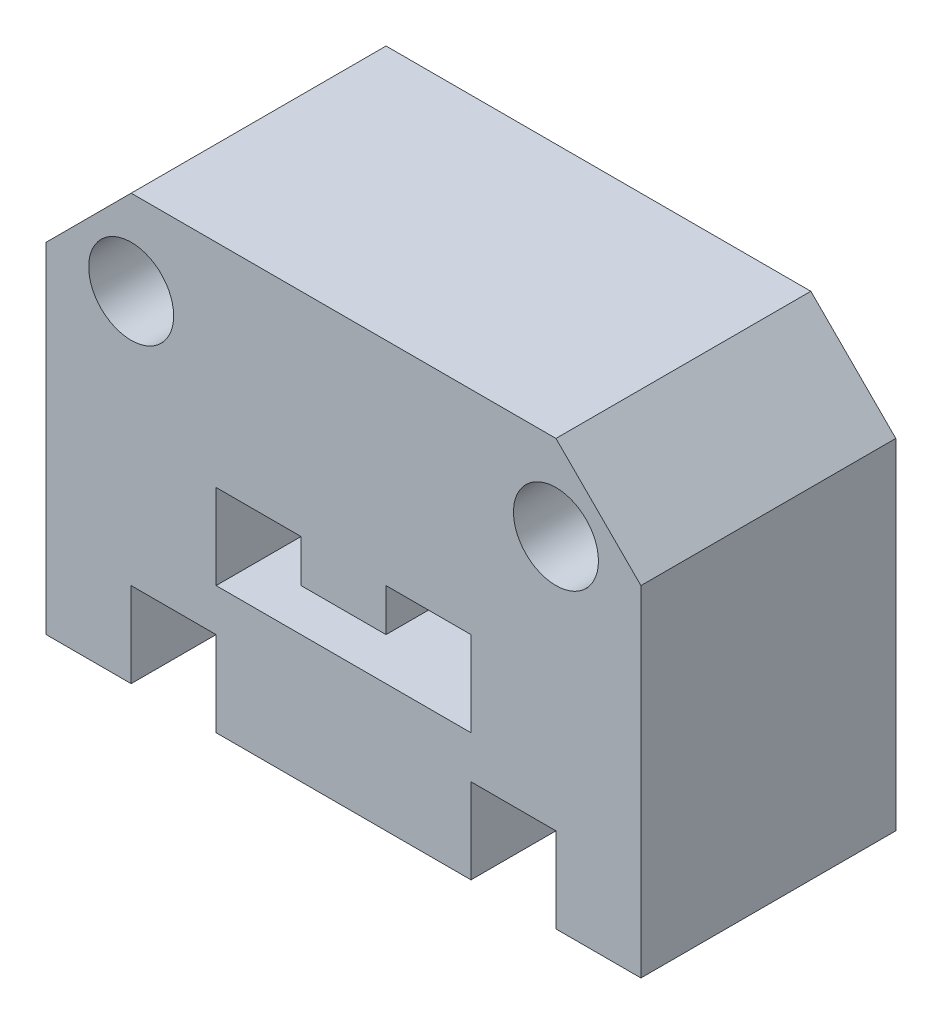
ISO-10303-21;
HEADER;
FILE_DESCRIPTION(('STEP AP214'),'2;1');
FILE_NAME('part.step','',(''),(''),'','','');
FILE_SCHEMA(('AUTOMOTIVE_DESIGN { 1 0 10303 214 1 1 1 1 }'));
ENDSEC;
DATA;
#1=APPLICATION_CONTEXT('core data for automotive mechanical design processes');
#2=APPLICATION_PROTOCOL_DEFINITION('international standard','automotive_design',2000,#1);
#3=PRODUCT_CONTEXT('',#1,'mechanical');
#4=PRODUCT('Part','Part','',(#3));
#5=PRODUCT_RELATED_PRODUCT_CATEGORY('part','',(#4));
#6=PRODUCT_DEFINITION_FORMATION('','',#4);
#7=PRODUCT_DEFINITION_CONTEXT('part definition',#1,'design');
#8=PRODUCT_DEFINITION('design','',#6,#7);
#9=PRODUCT_DEFINITION_SHAPE('','',#8);
#10=(LENGTH_UNIT() NAMED_UNIT(*) SI_UNIT(.MILLI.,.METRE.));
#11=(NAMED_UNIT(*) PLANE_ANGLE_UNIT() SI_UNIT($,.RADIAN.));
#12=(NAMED_UNIT(*) SI_UNIT($,.STERADIAN.) SOLID_ANGLE_UNIT());
#13=UNCERTAINTY_MEASURE_WITH_UNIT(LENGTH_MEASURE(1.E-05),#10,'distance_accuracy_value','');
#14=(GEOMETRIC_REPRESENTATION_CONTEXT(3) GLOBAL_UNCERTAINTY_ASSIGNED_CONTEXT((#13)) GLOBAL_UNIT_ASSIGNED_CONTEXT((#10,
#11,#12)) REPRESENTATION_CONTEXT('',''));
#15=CARTESIAN_POINT('',(0.,0.,0.));
#16=DIRECTION('',(0.,0.,1.));
#17=DIRECTION('',(1.,0.,0.));
#18=AXIS2_PLACEMENT_3D('',#15,#16,#17);
#19=CARTESIAN_POINT('',(0.,0.,15.));
#20=DIRECTION('',(0.,0.,-1.));
#21=DIRECTION('',(-1.,0.,0.));
#22=AXIS2_PLACEMENT_3D('',#19,#20,#21);
#23=PLANE('',#22);
#24=DIRECTION('',(1.,0.,0.));
#25=VECTOR('',#24,1.);
#26=CARTESIAN_POINT('',(25.,0.,15.));
#27=LINE('',#26,#25);
#28=CARTESIAN_POINT('',(25.,0.,15.));
#29=VERTEX_POINT('',#28);
#30=CARTESIAN_POINT('',(35.,0.,15.));
#31=VERTEX_POINT('',#30);
#32=EDGE_CURVE('E258',#29,#31,#27,.T.);
#33=ORIENTED_EDGE('',*,*,#32,.T.);
#34=DIRECTION('',(0.,1.,0.));
#35=VECTOR('',#34,1.);
#36=CARTESIAN_POINT('',(35.,40.,15.));
#37=LINE('',#36,#35);
#38=CARTESIAN_POINT('',(35.,40.,15.));
#39=VERTEX_POINT('',#38);
#40=EDGE_CURVE('E260',#31,#39,#37,.T.);
#41=ORIENTED_EDGE('',*,*,#40,.T.);
#42=DIRECTION('',(-0.707106781186548,0.707106781186547,0.));
#43=VECTOR('',#42,1.);
#44=CARTESIAN_POINT('',(25.,50.,15.));
#45=LINE('',#44,#43);
#46=CARTESIAN_POINT('',(25.,50.,15.));
#47=VERTEX_POINT('',#46);
#48=EDGE_CURVE('E265',#39,#47,#45,.T.);
#49=ORIENTED_EDGE('',*,*,#48,.T.);
#50=DIRECTION('',(-1.,0.,0.));
#51=VECTOR('',#50,1.);
#52=CARTESIAN_POINT('',(-25.,50.,15.));
#53=LINE('',#52,#51);
#54=CARTESIAN_POINT('',(-25.,50.,15.));
#55=VERTEX_POINT('',#54);
#56=EDGE_CURVE('E264',#47,#55,#53,.T.);
#57=ORIENTED_EDGE('',*,*,#56,.T.);
#58=DIRECTION('',(-0.707106781186548,-0.707106781186546,0.));
#59=VECTOR('',#58,1.);
#60=CARTESIAN_POINT('',(-35.,40.,15.));
#61=LINE('',#60,#59);
#62=CARTESIAN_POINT('',(-35.,40.,15.));
#63=VERTEX_POINT('',#62);
#64=EDGE_CURVE('E266',#55,#63,#61,.T.);
#65=ORIENTED_EDGE('',*,*,#64,.T.);
#66=DIRECTION('',(0.,-1.,0.));
#67=VECTOR('',#66,1.);
#68=CARTESIAN_POINT('',(-35.,40.,15.));
#69=LINE('',#68,#67);
#70=CARTESIAN_POINT('',(-35.,0.,15.));
#71=VERTEX_POINT('',#70);
#72=EDGE_CURVE('E268',#63,#71,#69,.T.);
#73=ORIENTED_EDGE('',*,*,#72,.T.);
#74=DIRECTION('',(1.,0.,0.));
#75=VECTOR('',#74,1.);
#76=CARTESIAN_POINT('',(-35.,0.,15.));
#77=LINE('',#76,#75);
#78=CARTESIAN_POINT('',(-25.,0.,15.));
#79=VERTEX_POINT('',#78);
#80=EDGE_CURVE('E269',#71,#79,#77,.T.);
#81=ORIENTED_EDGE('',*,*,#80,.T.);
#82=DIRECTION('',(0.,1.,0.));
#83=VECTOR('',#82,1.);
#84=CARTESIAN_POINT('',(-25.,0.,15.));
#85=LINE('',#84,#83);
#86=CARTESIAN_POINT('',(-25.,10.,15.));
#87=VERTEX_POINT('',#86);
#88=EDGE_CURVE('E275',#79,#87,#85,.T.);
#89=ORIENTED_EDGE('',*,*,#88,.T.);
#90=DIRECTION('',(1.,0.,0.));
#91=VECTOR('',#90,1.);
#92=CARTESIAN_POINT('',(-25.,10.,15.));
#93=LINE('',#92,#91);
#94=CARTESIAN_POINT('',(-15.,10.,15.));
#95=VERTEX_POINT('',#94);
#96=EDGE_CURVE('E272',#87,#95,#93,.T.);
#97=ORIENTED_EDGE('',*,*,#96,.T.);
#98=DIRECTION('',(0.,-1.,0.));
#99=VECTOR('',#98,1.);
#100=CARTESIAN_POINT('',(-15.,10.,15.));
#101=LINE('',#100,#99);
#102=CARTESIAN_POINT('',(-15.,0.,15.));
#103=VERTEX_POINT('',#102);
#104=EDGE_CURVE('E276',#95,#103,#101,.T.);
#105=ORIENTED_EDGE('',*,*,#104,.T.);
#106=DIRECTION('',(1.,0.,0.));
#107=VECTOR('',#106,1.);
#108=CARTESIAN_POINT('',(-15.,0.,15.));
#109=LINE('',#108,#107);
#110=CARTESIAN_POINT('',(15.,0.,15.));
#111=VERTEX_POINT('',#110);
#112=EDGE_CURVE('E277',#103,#111,#109,.T.);
#113=ORIENTED_EDGE('',*,*,#112,.T.);
#114=DIRECTION('',(0.,1.,0.));
#115=VECTOR('',#114,1.);
#116=CARTESIAN_POINT('',(15.,10.,15.));
#117=LINE('',#116,#115);
#118=CARTESIAN_POINT('',(15.,10.,15.));
#119=VERTEX_POINT('',#118);
#120=EDGE_CURVE('E279',#111,#119,#117,.T.);
#121=ORIENTED_EDGE('',*,*,#120,.T.);
#122=DIRECTION('',(1.,0.,0.));
#123=VECTOR('',#122,1.);
#124=CARTESIAN_POINT('',(25.,10.,15.));
#125=LINE('',#124,#123);
#126=CARTESIAN_POINT('',(25.,10.,15.));
#127=VERTEX_POINT('',#126);
#128=EDGE_CURVE('E285',#119,#127,#125,.T.);
#129=ORIENTED_EDGE('',*,*,#128,.T.);
#130=DIRECTION('',(0.,-1.,0.));
#131=VECTOR('',#130,1.);
#132=CARTESIAN_POINT('',(25.,0.,15.));
#133=LINE('',#132,#131);
#134=EDGE_CURVE('E281',#127,#29,#133,.T.);
#135=ORIENTED_EDGE('',*,*,#134,.T.);
#136=EDGE_LOOP('',(#33,#41,#49,#57,#65,#73,#81,#89,#97,#105,#113,#121,#129,#135));
#137=FACE_BOUND('',#136,.T.);
#138=DIRECTION('',(0.,-1.,0.));
#139=VECTOR('',#138,1.);
#140=CARTESIAN_POINT('',(-15.,15.,15.));
#141=LINE('',#140,#139);
#142=CARTESIAN_POINT('',(-15.,25.,15.));
#143=VERTEX_POINT('',#142);
#144=CARTESIAN_POINT('',(-15.,15.,15.));
#145=VERTEX_POINT('',#144);
#146=EDGE_CURVE('E187',#143,#145,#141,.T.);
#147=ORIENTED_EDGE('',*,*,#146,.F.);
#148=DIRECTION('',(-1.,0.,0.));
#149=VECTOR('',#148,1.);
#150=CARTESIAN_POINT('',(-15.,25.,15.));
#151=LINE('',#150,#149);
#152=CARTESIAN_POINT('',(-5.,25.,15.));
#153=VERTEX_POINT('',#152);
#154=EDGE_CURVE('E223',#153,#143,#151,.T.);
#155=ORIENTED_EDGE('',*,*,#154,.F.);
#156=DIRECTION('',(0.,1.,0.));
#157=VECTOR('',#156,1.);
#158=CARTESIAN_POINT('',(-5.,25.,15.));
#159=LINE('',#158,#157);
#160=CARTESIAN_POINT('',(-5.,20.,15.));
#161=VERTEX_POINT('',#160);
#162=EDGE_CURVE('E221',#161,#153,#159,.T.);
#163=ORIENTED_EDGE('',*,*,#162,.F.);
#164=DIRECTION('',(-1.,0.,0.));
#165=VECTOR('',#164,1.);
#166=CARTESIAN_POINT('',(-5.,20.,15.));
#167=LINE('',#166,#165);
#168=CARTESIAN_POINT('',(4.99999999999999,20.,15.));
#169=VERTEX_POINT('',#168);
#170=EDGE_CURVE('E219',#169,#161,#167,.T.);
#171=ORIENTED_EDGE('',*,*,#170,.F.);
#172=DIRECTION('',(0.,-1.,0.));
#173=VECTOR('',#172,1.);
#174=CARTESIAN_POINT('',(4.99999999999999,20.,15.));
#175=LINE('',#174,#173);
#176=CARTESIAN_POINT('',(4.99999999999999,25.,15.));
#177=VERTEX_POINT('',#176);
#178=EDGE_CURVE('E220',#177,#169,#175,.T.);
#179=ORIENTED_EDGE('',*,*,#178,.F.);
#180=DIRECTION('',(-1.,0.,0.));
#181=VECTOR('',#180,1.);
#182=CARTESIAN_POINT('',(4.99999999999999,25.,15.));
#183=LINE('',#182,#181);
#184=CARTESIAN_POINT('',(15.,25.,15.));
#185=VERTEX_POINT('',#184);
#186=EDGE_CURVE('E212',#185,#177,#183,.T.);
#187=ORIENTED_EDGE('',*,*,#186,.F.);
#188=DIRECTION('',(0.,1.,0.));
#189=VECTOR('',#188,1.);
#190=CARTESIAN_POINT('',(15.,15.,15.));
#191=LINE('',#190,#189);
#192=CARTESIAN_POINT('',(15.,15.,15.));
#193=VERTEX_POINT('',#192);
#194=EDGE_CURVE('E210',#193,#185,#191,.T.);
#195=ORIENTED_EDGE('',*,*,#194,.F.);
#196=DIRECTION('',(1.,0.,0.));
#197=VECTOR('',#196,1.);
#198=CARTESIAN_POINT('',(-15.,15.,15.));
#199=LINE('',#198,#197);
#200=EDGE_CURVE('E196',#145,#193,#199,.T.);
#201=ORIENTED_EDGE('',*,*,#200,.F.);
#202=EDGE_LOOP('',(#147,#155,#163,#171,#179,#187,#195,#201));
#203=FACE_BOUND('',#202,.T.);
#204=CARTESIAN_POINT('',(-25.,40.,15.));
#205=DIRECTION('',(0.,0.,1.));
#206=DIRECTION('',(1.,0.,0.));
#207=AXIS2_PLACEMENT_3D('',#204,#205,#206);
#208=CIRCLE('',#207,5.);
#209=CARTESIAN_POINT('',(-20.,40.,15.));
#210=VERTEX_POINT('',#209);
#211=EDGE_CURVE('E226',#210,#210,#208,.T.);
#212=ORIENTED_EDGE('',*,*,#211,.F.);
#213=EDGE_LOOP('',(#212));
#214=FACE_BOUND('',#213,.T.);
#215=CARTESIAN_POINT('',(25.,40.,15.));
#216=DIRECTION('',(0.,0.,1.));
#217=DIRECTION('',(1.,0.,0.));
#218=AXIS2_PLACEMENT_3D('',#215,#216,#217);
#219=CIRCLE('',#218,5.);
#220=CARTESIAN_POINT('',(30.,40.,15.));
#221=VERTEX_POINT('',#220);
#222=EDGE_CURVE('E643',#221,#221,#219,.T.);
#223=ORIENTED_EDGE('',*,*,#222,.F.);
#224=EDGE_LOOP('',(#223));
#225=FACE_BOUND('',#224,.T.);
#226=ADVANCED_FACE('F39',(#137,#203,#214,#225),#23,.F.);
#227=CARTESIAN_POINT('',(0.,0.,-15.));
#228=DIRECTION('',(0.,0.,-1.));
#229=DIRECTION('',(-1.,0.,0.));
#230=AXIS2_PLACEMENT_3D('',#227,#228,#229);
#231=PLANE('',#230);
#232=CARTESIAN_POINT('',(-25.,40.,-15.));
#233=DIRECTION('',(0.,0.,1.));
#234=DIRECTION('',(1.,0.,0.));
#235=AXIS2_PLACEMENT_3D('',#232,#233,#234);
#236=CIRCLE('',#235,5.);
#237=CARTESIAN_POINT('',(-20.,40.,-15.));
#238=VERTEX_POINT('',#237);
#239=EDGE_CURVE('E652',#238,#238,#236,.T.);
#240=ORIENTED_EDGE('',*,*,#239,.T.);
#241=EDGE_LOOP('',(#240));
#242=FACE_BOUND('',#241,.T.);
#243=DIRECTION('',(1.,0.,0.));
#244=VECTOR('',#243,1.);
#245=CARTESIAN_POINT('',(25.,0.,-15.));
#246=LINE('',#245,#244);
#247=CARTESIAN_POINT('',(25.,0.,-15.));
#248=VERTEX_POINT('',#247);
#249=CARTESIAN_POINT('',(35.,0.,-15.));
#250=VERTEX_POINT('',#249);
#251=EDGE_CURVE('E204',#248,#250,#246,.T.);
#252=ORIENTED_EDGE('',*,*,#251,.F.);
#253=DIRECTION('',(0.,-1.,0.));
#254=VECTOR('',#253,1.);
#255=CARTESIAN_POINT('',(25.,0.,-15.));
#256=LINE('',#255,#254);
#257=CARTESIAN_POINT('',(25.,10.,-15.));
#258=VERTEX_POINT('',#257);
#259=EDGE_CURVE('E259',#258,#248,#256,.T.);
#260=ORIENTED_EDGE('',*,*,#259,.F.);
#261=DIRECTION('',(1.,0.,0.));
#262=VECTOR('',#261,1.);
#263=CARTESIAN_POINT('',(25.,10.,-15.));
#264=LINE('',#263,#262);
#265=CARTESIAN_POINT('',(15.,10.,-15.));
#266=VERTEX_POINT('',#265);
#267=EDGE_CURVE('E311',#266,#258,#264,.T.);
#268=ORIENTED_EDGE('',*,*,#267,.F.);
#269=DIRECTION('',(0.,1.,0.));
#270=VECTOR('',#269,1.);
#271=CARTESIAN_POINT('',(15.,10.,-15.));
#272=LINE('',#271,#270);
#273=CARTESIAN_POINT('',(15.,0.,-15.));
#274=VERTEX_POINT('',#273);
#275=EDGE_CURVE('E309',#274,#266,#272,.T.);
#276=ORIENTED_EDGE('',*,*,#275,.F.);
#277=DIRECTION('',(1.,0.,0.));
#278=VECTOR('',#277,1.);
#279=CARTESIAN_POINT('',(-15.,0.,-15.));
#280=LINE('',#279,#278);
#281=CARTESIAN_POINT('',(-15.,0.,-15.));
#282=VERTEX_POINT('',#281);
#283=EDGE_CURVE('E310',#282,#274,#280,.T.);
#284=ORIENTED_EDGE('',*,*,#283,.F.);
#285=DIRECTION('',(0.,-1.,0.));
#286=VECTOR('',#285,1.);
#287=CARTESIAN_POINT('',(-15.,10.,-15.));
#288=LINE('',#287,#286);
#289=CARTESIAN_POINT('',(-15.,10.,-15.));
#290=VERTEX_POINT('',#289);
#291=EDGE_CURVE('E304',#290,#282,#288,.T.);
#292=ORIENTED_EDGE('',*,*,#291,.F.);
#293=DIRECTION('',(1.,0.,0.));
#294=VECTOR('',#293,1.);
#295=CARTESIAN_POINT('',(-25.,10.,-15.));
#296=LINE('',#295,#294);
#297=CARTESIAN_POINT('',(-25.,10.,-15.));
#298=VERTEX_POINT('',#297);
#299=EDGE_CURVE('E301',#298,#290,#296,.T.);
#300=ORIENTED_EDGE('',*,*,#299,.F.);
#301=DIRECTION('',(0.,1.,0.));
#302=VECTOR('',#301,1.);
#303=CARTESIAN_POINT('',(-25.,0.,-15.));
#304=LINE('',#303,#302);
#305=CARTESIAN_POINT('',(-25.,0.,-15.));
#306=VERTEX_POINT('',#305);
#307=EDGE_CURVE('E303',#306,#298,#304,.T.);
#308=ORIENTED_EDGE('',*,*,#307,.F.);
#309=DIRECTION('',(1.,0.,0.));
#310=VECTOR('',#309,1.);
#311=CARTESIAN_POINT('',(-35.,0.,-15.));
#312=LINE('',#311,#310);
#313=CARTESIAN_POINT('',(-35.,0.,-15.));
#314=VERTEX_POINT('',#313);
#315=EDGE_CURVE('E298',#314,#306,#312,.T.);
#316=ORIENTED_EDGE('',*,*,#315,.F.);
#317=DIRECTION('',(0.,-1.,0.));
#318=VECTOR('',#317,1.);
#319=CARTESIAN_POINT('',(-35.,40.,-15.));
#320=LINE('',#319,#318);
#321=CARTESIAN_POINT('',(-35.,40.,-15.));
#322=VERTEX_POINT('',#321);
#323=EDGE_CURVE('E297',#322,#314,#320,.T.);
#324=ORIENTED_EDGE('',*,*,#323,.F.);
#325=DIRECTION('',(-0.707106781186548,-0.707106781186546,0.));
#326=VECTOR('',#325,1.);
#327=CARTESIAN_POINT('',(-35.,40.,-15.));
#328=LINE('',#327,#326);
#329=CARTESIAN_POINT('',(-25.,50.,-15.));
#330=VERTEX_POINT('',#329);
#331=EDGE_CURVE('E293',#330,#322,#328,.T.);
#332=ORIENTED_EDGE('',*,*,#331,.F.);
#333=DIRECTION('',(-1.,0.,0.));
#334=VECTOR('',#333,1.);
#335=CARTESIAN_POINT('',(-25.,50.,-15.));
#336=LINE('',#335,#334);
#337=CARTESIAN_POINT('',(25.,50.,-15.));
#338=VERTEX_POINT('',#337);
#339=EDGE_CURVE('E291',#338,#330,#336,.T.);
#340=ORIENTED_EDGE('',*,*,#339,.F.);
#341=DIRECTION('',(-0.707106781186548,0.707106781186547,0.));
#342=VECTOR('',#341,1.);
#343=CARTESIAN_POINT('',(25.,50.,-15.));
#344=LINE('',#343,#342);
#345=CARTESIAN_POINT('',(35.,40.,-15.));
#346=VERTEX_POINT('',#345);
#347=EDGE_CURVE('E292',#346,#338,#344,.T.);
#348=ORIENTED_EDGE('',*,*,#347,.F.);
#349=DIRECTION('',(0.,1.,0.));
#350=VECTOR('',#349,1.);
#351=CARTESIAN_POINT('',(35.,40.,-15.));
#352=LINE('',#351,#350);
#353=EDGE_CURVE('E288',#250,#346,#352,.T.);
#354=ORIENTED_EDGE('',*,*,#353,.F.);
#355=EDGE_LOOP('',(#252,#260,#268,#276,#284,#292,#300,#308,#316,#324,#332,#340,#348,#354));
#356=FACE_BOUND('',#355,.T.);
#357=DIRECTION('',(-1.,0.,0.));
#358=VECTOR('',#357,1.);
#359=CARTESIAN_POINT('',(-15.,25.,-15.));
#360=LINE('',#359,#358);
#361=CARTESIAN_POINT('',(-5.,25.,-15.));
#362=VERTEX_POINT('',#361);
#363=CARTESIAN_POINT('',(-15.,25.,-15.));
#364=VERTEX_POINT('',#363);
#365=EDGE_CURVE('E197',#362,#364,#360,.T.);
#366=ORIENTED_EDGE('',*,*,#365,.T.);
#367=DIRECTION('',(0.,-1.,0.));
#368=VECTOR('',#367,1.);
#369=CARTESIAN_POINT('',(-15.,15.,-15.));
#370=LINE('',#369,#368);
#371=CARTESIAN_POINT('',(-15.,15.,-15.));
#372=VERTEX_POINT('',#371);
#373=EDGE_CURVE('E62',#364,#372,#370,.T.);
#374=ORIENTED_EDGE('',*,*,#373,.T.);
#375=DIRECTION('',(1.,0.,0.));
#376=VECTOR('',#375,1.);
#377=CARTESIAN_POINT('',(-15.,15.,-15.));
#378=LINE('',#377,#376);
#379=CARTESIAN_POINT('',(15.,15.,-15.));
#380=VERTEX_POINT('',#379);
#381=EDGE_CURVE('E201',#372,#380,#378,.T.);
#382=ORIENTED_EDGE('',*,*,#381,.T.);
#383=DIRECTION('',(0.,1.,0.));
#384=VECTOR('',#383,1.);
#385=CARTESIAN_POINT('',(15.,15.,-15.));
#386=LINE('',#385,#384);
#387=CARTESIAN_POINT('',(15.,25.,-15.));
#388=VERTEX_POINT('',#387);
#389=EDGE_CURVE('E228',#380,#388,#386,.T.);
#390=ORIENTED_EDGE('',*,*,#389,.T.);
#391=DIRECTION('',(-1.,0.,0.));
#392=VECTOR('',#391,1.);
#393=CARTESIAN_POINT('',(4.99999999999999,25.,-15.));
#394=LINE('',#393,#392);
#395=CARTESIAN_POINT('',(4.99999999999999,25.,-15.));
#396=VERTEX_POINT('',#395);
#397=EDGE_CURVE('E231',#388,#396,#394,.T.);
#398=ORIENTED_EDGE('',*,*,#397,.T.);
#399=DIRECTION('',(0.,-1.,0.));
#400=VECTOR('',#399,1.);
#401=CARTESIAN_POINT('',(4.99999999999999,20.,-15.));
#402=LINE('',#401,#400);
#403=CARTESIAN_POINT('',(4.99999999999999,20.,-15.));
#404=VERTEX_POINT('',#403);
#405=EDGE_CURVE('E233',#396,#404,#402,.T.);
#406=ORIENTED_EDGE('',*,*,#405,.T.);
#407=DIRECTION('',(-1.,0.,0.));
#408=VECTOR('',#407,1.);
#409=CARTESIAN_POINT('',(-5.,20.,-15.));
#410=LINE('',#409,#408);
#411=CARTESIAN_POINT('',(-5.,20.,-15.));
#412=VERTEX_POINT('',#411);
#413=EDGE_CURVE('E240',#404,#412,#410,.T.);
#414=ORIENTED_EDGE('',*,*,#413,.T.);
#415=DIRECTION('',(0.,1.,0.));
#416=VECTOR('',#415,1.);
#417=CARTESIAN_POINT('',(-5.,25.,-15.));
#418=LINE('',#417,#416);
#419=EDGE_CURVE('E238',#412,#362,#418,.T.);
#420=ORIENTED_EDGE('',*,*,#419,.T.);
#421=EDGE_LOOP('',(#366,#374,#382,#390,#398,#406,#414,#420));
#422=FACE_BOUND('',#421,.T.);
#423=CARTESIAN_POINT('',(25.,40.,-15.));
#424=DIRECTION('',(0.,0.,1.));
#425=DIRECTION('',(1.,0.,0.));
#426=AXIS2_PLACEMENT_3D('',#423,#424,#425);
#427=CIRCLE('',#426,5.);
#428=CARTESIAN_POINT('',(30.,40.,-15.));
#429=VERTEX_POINT('',#428);
#430=EDGE_CURVE('E649',#429,#429,#427,.T.);
#431=ORIENTED_EDGE('',*,*,#430,.T.);
#432=EDGE_LOOP('',(#431));
#433=FACE_BOUND('',#432,.T.);
#434=ADVANCED_FACE('F357',(#242,#356,#422,#433),#231,.T.);
#435=CARTESIAN_POINT('',(25.,0.,15.));
#436=DIRECTION('',(0.,1.,0.));
#437=DIRECTION('',(-1.,0.,0.));
#438=AXIS2_PLACEMENT_3D('',#435,#436,#437);
#439=PLANE('',#438);
#440=ORIENTED_EDGE('',*,*,#251,.T.);
#441=DIRECTION('',(0.,0.,-1.));
#442=VECTOR('',#441,1.);
#443=CARTESIAN_POINT('',(35.,0.,15.));
#444=LINE('',#443,#442);
#445=EDGE_CURVE('E11',#31,#250,#444,.T.);
#446=ORIENTED_EDGE('',*,*,#445,.F.);
#447=ORIENTED_EDGE('',*,*,#32,.F.);
#448=DIRECTION('',(0.,0.,-1.));
#449=VECTOR('',#448,1.);
#450=CARTESIAN_POINT('',(25.,0.,15.));
#451=LINE('',#450,#449);
#452=EDGE_CURVE('E286',#29,#248,#451,.T.);
#453=ORIENTED_EDGE('',*,*,#452,.T.);
#454=EDGE_LOOP('',(#440,#446,#447,#453));
#455=FACE_BOUND('',#454,.T.);
#456=ADVANCED_FACE('F41',(#455),#439,.F.);
#457=CARTESIAN_POINT('',(35.,40.,15.));
#458=DIRECTION('',(-1.,0.,0.));
#459=DIRECTION('',(0.,-1.,0.));
#460=AXIS2_PLACEMENT_3D('',#457,#458,#459);
#461=PLANE('',#460);
#462=ORIENTED_EDGE('',*,*,#353,.T.);
#463=DIRECTION('',(0.,0.,-1.));
#464=VECTOR('',#463,1.);
#465=CARTESIAN_POINT('',(35.,40.,15.));
#466=LINE('',#465,#464);
#467=EDGE_CURVE('E50',#39,#346,#466,.T.);
#468=ORIENTED_EDGE('',*,*,#467,.F.);
#469=ORIENTED_EDGE('',*,*,#40,.F.);
#470=ORIENTED_EDGE('',*,*,#445,.T.);
#471=EDGE_LOOP('',(#462,#468,#469,#470));
#472=FACE_BOUND('',#471,.T.);
#473=ADVANCED_FACE('F376',(#472),#461,.F.);
#474=CARTESIAN_POINT('',(25.,50.,15.));
#475=DIRECTION('',(-0.707106781186547,-0.707106781186548,0.));
#476=DIRECTION('',(0.707106781186548,-0.707106781186547,0.));
#477=AXIS2_PLACEMENT_3D('',#474,#475,#476);
#478=PLANE('',#477);
#479=ORIENTED_EDGE('',*,*,#347,.T.);
#480=DIRECTION('',(0.,0.,-1.));
#481=VECTOR('',#480,1.);
#482=CARTESIAN_POINT('',(25.,50.,15.));
#483=LINE('',#482,#481);
#484=EDGE_CURVE('E348',#47,#338,#483,.T.);
#485=ORIENTED_EDGE('',*,*,#484,.F.);
#486=ORIENTED_EDGE('',*,*,#48,.F.);
#487=ORIENTED_EDGE('',*,*,#467,.T.);
#488=EDGE_LOOP('',(#479,#485,#486,#487));
#489=FACE_BOUND('',#488,.T.);
#490=ADVANCED_FACE('F351',(#489),#478,.F.);
#491=CARTESIAN_POINT('',(-25.,50.,15.));
#492=DIRECTION('',(0.,-1.,0.));
#493=DIRECTION('',(1.,0.,0.));
#494=AXIS2_PLACEMENT_3D('',#491,#492,#493);
#495=PLANE('',#494);
#496=ORIENTED_EDGE('',*,*,#339,.T.);
#497=DIRECTION('',(0.,0.,-1.));
#498=VECTOR('',#497,1.);
#499=CARTESIAN_POINT('',(-25.,50.,15.));
#500=LINE('',#499,#498);
#501=EDGE_CURVE('E344',#55,#330,#500,.T.);
#502=ORIENTED_EDGE('',*,*,#501,.F.);
#503=ORIENTED_EDGE('',*,*,#56,.F.);
#504=ORIENTED_EDGE('',*,*,#484,.T.);
#505=EDGE_LOOP('',(#496,#502,#503,#504));
#506=FACE_BOUND('',#505,.T.);
#507=ADVANCED_FACE('F364',(#506),#495,.F.);
#508=CARTESIAN_POINT('',(-35.,40.,15.));
#509=DIRECTION('',(0.707106781186546,-0.707106781186549,0.));
#510=DIRECTION('',(0.707106781186549,0.707106781186546,0.));
#511=AXIS2_PLACEMENT_3D('',#508,#509,#510);
#512=PLANE('',#511);
#513=ORIENTED_EDGE('',*,*,#331,.T.);
#514=DIRECTION('',(0.,0.,-1.));
#515=VECTOR('',#514,1.);
#516=CARTESIAN_POINT('',(-35.,40.,15.));
#517=LINE('',#516,#515);
#518=EDGE_CURVE('E338',#63,#322,#517,.T.);
#519=ORIENTED_EDGE('',*,*,#518,.F.);
#520=ORIENTED_EDGE('',*,*,#64,.F.);
#521=ORIENTED_EDGE('',*,*,#501,.T.);
#522=EDGE_LOOP('',(#513,#519,#520,#521));
#523=FACE_BOUND('',#522,.T.);
#524=ADVANCED_FACE('F368',(#523),#512,.F.);
#525=CARTESIAN_POINT('',(-35.,40.,15.));
#526=DIRECTION('',(1.,0.,0.));
#527=DIRECTION('',(0.,1.,0.));
#528=AXIS2_PLACEMENT_3D('',#525,#526,#527);
#529=PLANE('',#528);
#530=ORIENTED_EDGE('',*,*,#323,.T.);
#531=DIRECTION('',(0.,0.,-1.));
#532=VECTOR('',#531,1.);
#533=CARTESIAN_POINT('',(-35.,0.,15.));
#534=LINE('',#533,#532);
#535=EDGE_CURVE('E340',#71,#314,#534,.T.);
#536=ORIENTED_EDGE('',*,*,#535,.F.);
#537=ORIENTED_EDGE('',*,*,#72,.F.);
#538=ORIENTED_EDGE('',*,*,#518,.T.);
#539=EDGE_LOOP('',(#530,#536,#537,#538));
#540=FACE_BOUND('',#539,.T.);
#541=ADVANCED_FACE('F416',(#540),#529,.F.);
#542=CARTESIAN_POINT('',(-35.,0.,15.));
#543=DIRECTION('',(0.,1.,0.));
#544=DIRECTION('',(-1.,0.,0.));
#545=AXIS2_PLACEMENT_3D('',#542,#543,#544);
#546=PLANE('',#545);
#547=ORIENTED_EDGE('',*,*,#315,.T.);
#548=DIRECTION('',(0.,0.,-1.));
#549=VECTOR('',#548,1.);
#550=CARTESIAN_POINT('',(-25.,0.,15.));
#551=LINE('',#550,#549);
#552=EDGE_CURVE('E333',#79,#306,#551,.T.);
#553=ORIENTED_EDGE('',*,*,#552,.F.);
#554=ORIENTED_EDGE('',*,*,#80,.F.);
#555=ORIENTED_EDGE('',*,*,#535,.T.);
#556=EDGE_LOOP('',(#547,#553,#554,#555));
#557=FACE_BOUND('',#556,.T.);
#558=ADVANCED_FACE('F420',(#557),#546,.F.);
#559=CARTESIAN_POINT('',(-25.,0.,15.));
#560=DIRECTION('',(-1.,0.,0.));
#561=DIRECTION('',(0.,0.,1.));
#562=AXIS2_PLACEMENT_3D('',#559,#560,#561);
#563=PLANE('',#562);
#564=ORIENTED_EDGE('',*,*,#307,.T.);
#565=DIRECTION('',(0.,0.,-1.));
#566=VECTOR('',#565,1.);
#567=CARTESIAN_POINT('',(-25.,10.,15.));
#568=LINE('',#567,#566);
#569=EDGE_CURVE('E331',#87,#298,#568,.T.);
#570=ORIENTED_EDGE('',*,*,#569,.F.);
#571=ORIENTED_EDGE('',*,*,#88,.F.);
#572=ORIENTED_EDGE('',*,*,#552,.T.);
#573=EDGE_LOOP('',(#564,#570,#571,#572));
#574=FACE_BOUND('',#573,.T.);
#575=ADVANCED_FACE('F415',(#574),#563,.F.);
#576=CARTESIAN_POINT('',(-25.,10.,15.));
#577=DIRECTION('',(0.,1.,0.));
#578=DIRECTION('',(0.,0.,1.));
#579=AXIS2_PLACEMENT_3D('',#576,#577,#578);
#580=PLANE('',#579);
#581=ORIENTED_EDGE('',*,*,#299,.T.);
#582=DIRECTION('',(0.,0.,-1.));
#583=VECTOR('',#582,1.);
#584=CARTESIAN_POINT('',(-15.,10.,15.));
#585=LINE('',#584,#583);
#586=EDGE_CURVE('E329',#95,#290,#585,.T.);
#587=ORIENTED_EDGE('',*,*,#586,.F.);
#588=ORIENTED_EDGE('',*,*,#96,.F.);
#589=ORIENTED_EDGE('',*,*,#569,.T.);
#590=EDGE_LOOP('',(#581,#587,#588,#589));
#591=FACE_BOUND('',#590,.T.);
#592=ADVANCED_FACE('F410',(#591),#580,.F.);
#593=CARTESIAN_POINT('',(-15.,10.,15.));
#594=DIRECTION('',(1.,0.,0.));
#595=DIRECTION('',(0.,1.,0.));
#596=AXIS2_PLACEMENT_3D('',#593,#594,#595);
#597=PLANE('',#596);
#598=ORIENTED_EDGE('',*,*,#291,.T.);
#599=DIRECTION('',(0.,0.,-1.));
#600=VECTOR('',#599,1.);
#601=CARTESIAN_POINT('',(-15.,0.,15.));
#602=LINE('',#601,#600);
#603=EDGE_CURVE('E324',#103,#282,#602,.T.);
#604=ORIENTED_EDGE('',*,*,#603,.F.);
#605=ORIENTED_EDGE('',*,*,#104,.F.);
#606=ORIENTED_EDGE('',*,*,#586,.T.);
#607=EDGE_LOOP('',(#598,#604,#605,#606));
#608=FACE_BOUND('',#607,.T.);
#609=ADVANCED_FACE('F403',(#608),#597,.F.);
#610=CARTESIAN_POINT('',(-15.,0.,15.));
#611=DIRECTION('',(0.,1.,0.));
#612=DIRECTION('',(-1.,0.,0.));
#613=AXIS2_PLACEMENT_3D('',#610,#611,#612);
#614=PLANE('',#613);
#615=ORIENTED_EDGE('',*,*,#283,.T.);
#616=DIRECTION('',(0.,0.,-1.));
#617=VECTOR('',#616,1.);
#618=CARTESIAN_POINT('',(15.,0.,15.));
#619=LINE('',#618,#617);
#620=EDGE_CURVE('E325',#111,#274,#619,.T.);
#621=ORIENTED_EDGE('',*,*,#620,.F.);
#622=ORIENTED_EDGE('',*,*,#112,.F.);
#623=ORIENTED_EDGE('',*,*,#603,.T.);
#624=EDGE_LOOP('',(#615,#621,#622,#623));
#625=FACE_BOUND('',#624,.T.);
#626=ADVANCED_FACE('F396',(#625),#614,.F.);
#627=CARTESIAN_POINT('',(15.,10.,15.));
#628=DIRECTION('',(-1.,0.,0.));
#629=DIRECTION('',(0.,-1.,0.));
#630=AXIS2_PLACEMENT_3D('',#627,#628,#629);
#631=PLANE('',#630);
#632=ORIENTED_EDGE('',*,*,#275,.T.);
#633=DIRECTION('',(0.,0.,-1.));
#634=VECTOR('',#633,1.);
#635=CARTESIAN_POINT('',(15.,10.,15.));
#636=LINE('',#635,#634);
#637=EDGE_CURVE('E317',#119,#266,#636,.T.);
#638=ORIENTED_EDGE('',*,*,#637,.F.);
#639=ORIENTED_EDGE('',*,*,#120,.F.);
#640=ORIENTED_EDGE('',*,*,#620,.T.);
#641=EDGE_LOOP('',(#632,#638,#639,#640));
#642=FACE_BOUND('',#641,.T.);
#643=ADVANCED_FACE('F392',(#642),#631,.F.);
#644=CARTESIAN_POINT('',(25.,10.,15.));
#645=DIRECTION('',(0.,1.,0.));
#646=DIRECTION('',(-1.,0.,0.));
#647=AXIS2_PLACEMENT_3D('',#644,#645,#646);
#648=PLANE('',#647);
#649=ORIENTED_EDGE('',*,*,#267,.T.);
#650=DIRECTION('',(0.,0.,-1.));
#651=VECTOR('',#650,1.);
#652=CARTESIAN_POINT('',(25.,10.,15.));
#653=LINE('',#652,#651);
#654=EDGE_CURVE('E316',#127,#258,#653,.T.);
#655=ORIENTED_EDGE('',*,*,#654,.F.);
#656=ORIENTED_EDGE('',*,*,#128,.F.);
#657=ORIENTED_EDGE('',*,*,#637,.T.);
#658=EDGE_LOOP('',(#649,#655,#656,#657));
#659=FACE_BOUND('',#658,.T.);
#660=ADVANCED_FACE('F389',(#659),#648,.F.);
#661=CARTESIAN_POINT('',(25.,0.,15.));
#662=DIRECTION('',(1.,0.,0.));
#663=DIRECTION('',(0.,0.,-1.));
#664=AXIS2_PLACEMENT_3D('',#661,#662,#663);
#665=PLANE('',#664);
#666=ORIENTED_EDGE('',*,*,#259,.T.);
#667=ORIENTED_EDGE('',*,*,#452,.F.);
#668=ORIENTED_EDGE('',*,*,#134,.F.);
#669=ORIENTED_EDGE('',*,*,#654,.T.);
#670=EDGE_LOOP('',(#666,#667,#668,#669));
#671=FACE_BOUND('',#670,.T.);
#672=ADVANCED_FACE('F381',(#671),#665,.F.);
#673=CARTESIAN_POINT('',(-15.,15.,15.));
#674=DIRECTION('',(1.,0.,0.));
#675=DIRECTION('',(0.,1.,0.));
#676=AXIS2_PLACEMENT_3D('',#673,#674,#675);
#677=PLANE('',#676);
#678=ORIENTED_EDGE('',*,*,#373,.F.);
#679=DIRECTION('',(0.,0.,-1.));
#680=VECTOR('',#679,1.);
#681=CARTESIAN_POINT('',(-15.,25.,15.));
#682=LINE('',#681,#680);
#683=EDGE_CURVE('E195',#143,#364,#682,.T.);
#684=ORIENTED_EDGE('',*,*,#683,.F.);
#685=ORIENTED_EDGE('',*,*,#146,.T.);
#686=DIRECTION('',(0.,0.,-1.));
#687=VECTOR('',#686,1.);
#688=CARTESIAN_POINT('',(-15.,15.,15.));
#689=LINE('',#688,#687);
#690=EDGE_CURVE('E192',#145,#372,#689,.T.);
#691=ORIENTED_EDGE('',*,*,#690,.T.);
#692=EDGE_LOOP('',(#678,#684,#685,#691));
#693=FACE_BOUND('',#692,.T.);
#694=ADVANCED_FACE('F189',(#693),#677,.T.);
#695=CARTESIAN_POINT('',(-15.,15.,15.));
#696=DIRECTION('',(0.,1.,0.));
#697=DIRECTION('',(-1.,0.,0.));
#698=AXIS2_PLACEMENT_3D('',#695,#696,#697);
#699=PLANE('',#698);
#700=ORIENTED_EDGE('',*,*,#381,.F.);
#701=ORIENTED_EDGE('',*,*,#690,.F.);
#702=ORIENTED_EDGE('',*,*,#200,.T.);
#703=DIRECTION('',(0.,0.,-1.));
#704=VECTOR('',#703,1.);
#705=CARTESIAN_POINT('',(15.,15.,15.));
#706=LINE('',#705,#704);
#707=EDGE_CURVE('E203',#193,#380,#706,.T.);
#708=ORIENTED_EDGE('',*,*,#707,.T.);
#709=EDGE_LOOP('',(#700,#701,#702,#708));
#710=FACE_BOUND('',#709,.T.);
#711=ADVANCED_FACE('F200',(#710),#699,.T.);
#712=CARTESIAN_POINT('',(15.,15.,15.));
#713=DIRECTION('',(-1.,0.,0.));
#714=DIRECTION('',(0.,-1.,0.));
#715=AXIS2_PLACEMENT_3D('',#712,#713,#714);
#716=PLANE('',#715);
#717=ORIENTED_EDGE('',*,*,#389,.F.);
#718=ORIENTED_EDGE('',*,*,#707,.F.);
#719=ORIENTED_EDGE('',*,*,#194,.T.);
#720=DIRECTION('',(0.,0.,-1.));
#721=VECTOR('',#720,1.);
#722=CARTESIAN_POINT('',(15.,25.,15.));
#723=LINE('',#722,#721);
#724=EDGE_CURVE('E254',#185,#388,#723,.T.);
#725=ORIENTED_EDGE('',*,*,#724,.T.);
#726=EDGE_LOOP('',(#717,#718,#719,#725));
#727=FACE_BOUND('',#726,.T.);
#728=ADVANCED_FACE('F498',(#727),#716,.T.);
#729=CARTESIAN_POINT('',(4.99999999999999,25.,15.));
#730=DIRECTION('',(0.,-1.,0.));
#731=DIRECTION('',(1.,0.,0.));
#732=AXIS2_PLACEMENT_3D('',#729,#730,#731);
#733=PLANE('',#732);
#734=ORIENTED_EDGE('',*,*,#397,.F.);
#735=ORIENTED_EDGE('',*,*,#724,.F.);
#736=ORIENTED_EDGE('',*,*,#186,.T.);
#737=DIRECTION('',(0.,0.,-1.));
#738=VECTOR('',#737,1.);
#739=CARTESIAN_POINT('',(4.99999999999999,25.,15.));
#740=LINE('',#739,#738);
#741=EDGE_CURVE('E251',#177,#396,#740,.T.);
#742=ORIENTED_EDGE('',*,*,#741,.T.);
#743=EDGE_LOOP('',(#734,#735,#736,#742));
#744=FACE_BOUND('',#743,.T.);
#745=ADVANCED_FACE('F504',(#744),#733,.T.);
#746=CARTESIAN_POINT('',(4.99999999999999,20.,15.));
#747=DIRECTION('',(1.,0.,0.));
#748=DIRECTION('',(0.,1.,0.));
#749=AXIS2_PLACEMENT_3D('',#746,#747,#748);
#750=PLANE('',#749);
#751=ORIENTED_EDGE('',*,*,#405,.F.);
#752=ORIENTED_EDGE('',*,*,#741,.F.);
#753=ORIENTED_EDGE('',*,*,#178,.T.);
#754=DIRECTION('',(0.,0.,-1.));
#755=VECTOR('',#754,1.);
#756=CARTESIAN_POINT('',(4.99999999999999,20.,15.));
#757=LINE('',#756,#755);
#758=EDGE_CURVE('E249',#169,#404,#757,.T.);
#759=ORIENTED_EDGE('',*,*,#758,.T.);
#760=EDGE_LOOP('',(#751,#752,#753,#759));
#761=FACE_BOUND('',#760,.T.);
#762=ADVANCED_FACE('F513',(#761),#750,.T.);
#763=CARTESIAN_POINT('',(-5.,20.,15.));
#764=DIRECTION('',(0.,-1.,0.));
#765=DIRECTION('',(1.,0.,0.));
#766=AXIS2_PLACEMENT_3D('',#763,#764,#765);
#767=PLANE('',#766);
#768=ORIENTED_EDGE('',*,*,#413,.F.);
#769=ORIENTED_EDGE('',*,*,#758,.F.);
#770=ORIENTED_EDGE('',*,*,#170,.T.);
#771=DIRECTION('',(0.,0.,-1.));
#772=VECTOR('',#771,1.);
#773=CARTESIAN_POINT('',(-5.,20.,15.));
#774=LINE('',#773,#772);
#775=EDGE_CURVE('E250',#161,#412,#774,.T.);
#776=ORIENTED_EDGE('',*,*,#775,.T.);
#777=EDGE_LOOP('',(#768,#769,#770,#776));
#778=FACE_BOUND('',#777,.T.);
#779=ADVANCED_FACE('F524',(#778),#767,.T.);
#780=CARTESIAN_POINT('',(-5.,25.,15.));
#781=DIRECTION('',(-1.,0.,0.));
#782=DIRECTION('',(0.,0.,1.));
#783=AXIS2_PLACEMENT_3D('',#780,#781,#782);
#784=PLANE('',#783);
#785=ORIENTED_EDGE('',*,*,#419,.F.);
#786=ORIENTED_EDGE('',*,*,#775,.F.);
#787=ORIENTED_EDGE('',*,*,#162,.T.);
#788=DIRECTION('',(0.,0.,-1.));
#789=VECTOR('',#788,1.);
#790=CARTESIAN_POINT('',(-5.,25.,15.));
#791=LINE('',#790,#789);
#792=EDGE_CURVE('E53',#153,#362,#791,.T.);
#793=ORIENTED_EDGE('',*,*,#792,.T.);
#794=EDGE_LOOP('',(#785,#786,#787,#793));
#795=FACE_BOUND('',#794,.T.);
#796=ADVANCED_FACE('F535',(#795),#784,.T.);
#797=CARTESIAN_POINT('',(-15.,25.,15.));
#798=DIRECTION('',(0.,-1.,0.));
#799=DIRECTION('',(0.,0.,-1.));
#800=AXIS2_PLACEMENT_3D('',#797,#798,#799);
#801=PLANE('',#800);
#802=ORIENTED_EDGE('',*,*,#365,.F.);
#803=ORIENTED_EDGE('',*,*,#792,.F.);
#804=ORIENTED_EDGE('',*,*,#154,.T.);
#805=ORIENTED_EDGE('',*,*,#683,.T.);
#806=EDGE_LOOP('',(#802,#803,#804,#805));
#807=FACE_BOUND('',#806,.T.);
#808=ADVANCED_FACE('F541',(#807),#801,.T.);
#809=CARTESIAN_POINT('',(-25.,40.,15.));
#810=DIRECTION('',(0.,0.,-1.));
#811=DIRECTION('',(-1.,0.,0.));
#812=AXIS2_PLACEMENT_3D('',#809,#810,#811);
#813=CYLINDRICAL_SURFACE('',#812,5.);
#814=ORIENTED_EDGE('',*,*,#211,.T.);
#815=EDGE_LOOP('',(#814));
#816=FACE_BOUND('',#815,.T.);
#817=ORIENTED_EDGE('',*,*,#239,.F.);
#818=EDGE_LOOP('',(#817));
#819=FACE_BOUND('',#818,.T.);
#820=ADVANCED_FACE('F549',(#816,#819),#813,.F.);
#821=CARTESIAN_POINT('',(25.,40.,15.));
#822=DIRECTION('',(0.,0.,-1.));
#823=DIRECTION('',(-1.,0.,0.));
#824=AXIS2_PLACEMENT_3D('',#821,#822,#823);
#825=CYLINDRICAL_SURFACE('',#824,5.);
#826=ORIENTED_EDGE('',*,*,#222,.T.);
#827=EDGE_LOOP('',(#826));
#828=FACE_BOUND('',#827,.T.);
#829=ORIENTED_EDGE('',*,*,#430,.F.);
#830=EDGE_LOOP('',(#829));
#831=FACE_BOUND('',#830,.T.);
#832=ADVANCED_FACE('F559',(#828,#831),#825,.F.);
#833=CLOSED_SHELL('',(#226,#434,#456,#473,#490,#507,#524,#541,#558,#575,#592,#609,#626,#643,
#660,#672,#694,#711,#728,#745,#762,#779,#796,#808,#820,#832));
#834=MANIFOLD_SOLID_BREP('B2',#833);
#835=ADVANCED_BREP_SHAPE_REPRESENTATION('',(#18,#834),#14);
#836=SHAPE_DEFINITION_REPRESENTATION(#9,#835);
ENDSEC;
END-ISO-10303-21;
